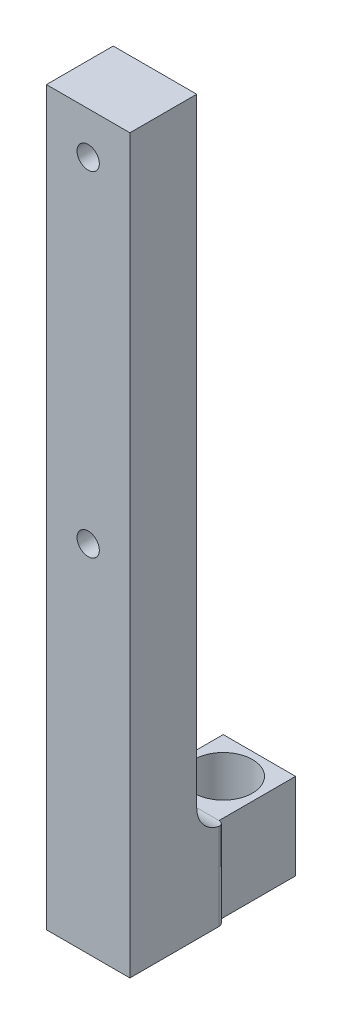
ISO-10303-21;
HEADER;
FILE_DESCRIPTION(('STEP AP214'),'2;1');
FILE_NAME('part.step','',(''),(''),'','','');
FILE_SCHEMA(('AUTOMOTIVE_DESIGN { 1 0 10303 214 1 1 1 1 }'));
ENDSEC;
DATA;
#1=APPLICATION_CONTEXT('core data for automotive mechanical design processes');
#2=APPLICATION_PROTOCOL_DEFINITION('international standard','automotive_design',2000,#1);
#3=PRODUCT_CONTEXT('',#1,'mechanical');
#4=PRODUCT('Part','Part','',(#3));
#5=PRODUCT_RELATED_PRODUCT_CATEGORY('part','',(#4));
#6=PRODUCT_DEFINITION_FORMATION('','',#4);
#7=PRODUCT_DEFINITION_CONTEXT('part definition',#1,'design');
#8=PRODUCT_DEFINITION('design','',#6,#7);
#9=PRODUCT_DEFINITION_SHAPE('','',#8);
#10=(LENGTH_UNIT() NAMED_UNIT(*) SI_UNIT(.MILLI.,.METRE.));
#11=(NAMED_UNIT(*) PLANE_ANGLE_UNIT() SI_UNIT($,.RADIAN.));
#12=(NAMED_UNIT(*) SI_UNIT($,.STERADIAN.) SOLID_ANGLE_UNIT());
#13=UNCERTAINTY_MEASURE_WITH_UNIT(LENGTH_MEASURE(1.E-05),#10,'distance_accuracy_value','');
#14=(GEOMETRIC_REPRESENTATION_CONTEXT(3) GLOBAL_UNCERTAINTY_ASSIGNED_CONTEXT((#13)) GLOBAL_UNIT_ASSIGNED_CONTEXT((#10,
#11,#12)) REPRESENTATION_CONTEXT('',''));
#15=CARTESIAN_POINT('',(0.,0.,0.));
#16=DIRECTION('',(0.,0.,1.));
#17=DIRECTION('',(1.,0.,0.));
#18=AXIS2_PLACEMENT_3D('',#15,#16,#17);
#19=CARTESIAN_POINT('',(3.25,65.76,6.13));
#20=DIRECTION('',(0.,0.,1.));
#21=DIRECTION('',(1.,0.,0.));
#22=AXIS2_PLACEMENT_3D('',#19,#20,#21);
#23=PLANE('',#22);
#24=DIRECTION('',(-1.,0.,0.));
#25=VECTOR('',#24,1.);
#26=CARTESIAN_POINT('',(3.25,65.76,6.13));
#27=LINE('',#26,#25);
#28=CARTESIAN_POINT('',(3.75,65.76,6.13));
#29=VERTEX_POINT('',#28);
#30=CARTESIAN_POINT('',(-3.75,65.76,6.13));
#31=VERTEX_POINT('',#30);
#32=EDGE_CURVE('E332',#29,#31,#27,.T.);
#33=ORIENTED_EDGE('',*,*,#32,.F.);
#34=DIRECTION('',(0.,1.,0.));
#35=VECTOR('',#34,1.);
#36=CARTESIAN_POINT('',(3.75,65.76,6.13));
#37=LINE('',#36,#35);
#38=CARTESIAN_POINT('',(3.75,10.25,6.13));
#39=VERTEX_POINT('',#38);
#40=EDGE_CURVE('E320',#39,#29,#37,.T.);
#41=ORIENTED_EDGE('',*,*,#40,.F.);
#42=DIRECTION('',(1.,0.,0.));
#43=VECTOR('',#42,1.);
#44=CARTESIAN_POINT('',(0.,10.25,6.13));
#45=LINE('',#44,#43);
#46=CARTESIAN_POINT('',(-3.75,10.25,6.13));
#47=VERTEX_POINT('',#46);
#48=EDGE_CURVE('E369',#39,#47,#45,.F.);
#49=ORIENTED_EDGE('',*,*,#48,.T.);
#50=DIRECTION('',(0.,1.,0.));
#51=VECTOR('',#50,1.);
#52=CARTESIAN_POINT('',(-3.75,65.76,6.13));
#53=LINE('',#52,#51);
#54=EDGE_CURVE('E312',#47,#31,#53,.T.);
#55=ORIENTED_EDGE('',*,*,#54,.T.);
#56=EDGE_LOOP('',(#33,#41,#49,#55));
#57=FACE_BOUND('',#56,.T.);
#58=DIRECTION('',(1.,0.,0.));
#59=VECTOR('',#58,1.);
#60=CARTESIAN_POINT('',(3.9427447207403E-13,63.923557158515,6.13));
#61=LINE('',#60,#59);
#62=CARTESIAN_POINT('',(-1.125,63.923557158515,6.13));
#63=VERTEX_POINT('',#62);
#64=CARTESIAN_POINT('',(1.12500000000001,63.923557158515,6.13));
#65=VERTEX_POINT('',#64);
#66=EDGE_CURVE('E272',#63,#65,#61,.T.);
#67=ORIENTED_EDGE('',*,*,#66,.F.);
#68=DIRECTION('',(0.5,0.866025403784439,0.));
#69=VECTOR('',#68,1.);
#70=CARTESIAN_POINT('',(-28.5234621997703,16.4680285792575,6.13));
#71=LINE('',#70,#69);
#72=CARTESIAN_POINT('',(-2.25000000000001,61.975,6.13));
#73=VERTEX_POINT('',#72);
#74=EDGE_CURVE('E64',#73,#63,#71,.T.);
#75=ORIENTED_EDGE('',*,*,#74,.F.);
#76=DIRECTION('',(-0.499999999999995,0.866025403784442,0.));
#77=VECTOR('',#76,1.);
#78=CARTESIAN_POINT('',(25.1484621997701,14.5194714207422,6.13));
#79=LINE('',#78,#77);
#80=CARTESIAN_POINT('',(-1.12500000000002,60.026442841485,6.13));
#81=VERTEX_POINT('',#80);
#82=EDGE_CURVE('E252',#81,#73,#79,.T.);
#83=ORIENTED_EDGE('',*,*,#82,.F.);
#84=DIRECTION('',(-1.,0.,0.));
#85=VECTOR('',#84,1.);
#86=CARTESIAN_POINT('',(5.55356157741354E-13,60.026442841485,6.13));
#87=LINE('',#86,#85);
#88=CARTESIAN_POINT('',(1.12499999999998,60.026442841485,6.13));
#89=VERTEX_POINT('',#88);
#90=EDGE_CURVE('E281',#89,#81,#87,.T.);
#91=ORIENTED_EDGE('',*,*,#90,.F.);
#92=DIRECTION('',(-0.500000000000007,-0.866025403784435,0.));
#93=VECTOR('',#92,1.);
#94=CARTESIAN_POINT('',(-25.1484621997706,14.5194714207429,6.13));
#95=LINE('',#94,#93);
#96=CARTESIAN_POINT('',(2.25000000000001,61.975,6.13));
#97=VERTEX_POINT('',#96);
#98=EDGE_CURVE('E278',#97,#89,#95,.T.);
#99=ORIENTED_EDGE('',*,*,#98,.F.);
#100=DIRECTION('',(0.499999999999995,-0.866025403784441,0.));
#101=VECTOR('',#100,1.);
#102=CARTESIAN_POINT('',(28.5234621997701,16.4680285792572,6.13));
#103=LINE('',#102,#101);
#104=EDGE_CURVE('E275',#65,#97,#103,.T.);
#105=ORIENTED_EDGE('',*,*,#104,.F.);
#106=EDGE_LOOP('',(#67,#75,#83,#91,#99,#105));
#107=FACE_BOUND('',#106,.T.);
#108=DIRECTION('',(0.5,-0.866025403784439,0.));
#109=VECTOR('',#108,1.);
#110=CARTESIAN_POINT('',(-28.5234621997703,77.4119714207425,6.13));
#111=LINE('',#110,#109);
#112=CARTESIAN_POINT('',(-2.25,31.905,6.13));
#113=VERTEX_POINT('',#112);
#114=CARTESIAN_POINT('',(-1.125,29.956442841485,6.13));
#115=VERTEX_POINT('',#114);
#116=EDGE_CURVE('E56',#113,#115,#111,.T.);
#117=ORIENTED_EDGE('',*,*,#116,.T.);
#118=DIRECTION('',(1.,0.,0.));
#119=VECTOR('',#118,1.);
#120=CARTESIAN_POINT('',(3.9427447207403E-13,29.956442841485,6.13));
#121=LINE('',#120,#119);
#122=CARTESIAN_POINT('',(1.12500000000001,29.956442841485,6.13));
#123=VERTEX_POINT('',#122);
#124=EDGE_CURVE('E213',#115,#123,#121,.T.);
#125=ORIENTED_EDGE('',*,*,#124,.T.);
#126=DIRECTION('',(0.499999999999995,0.866025403784441,0.));
#127=VECTOR('',#126,1.);
#128=CARTESIAN_POINT('',(28.5234621997701,77.4119714207428,6.13));
#129=LINE('',#128,#127);
#130=CARTESIAN_POINT('',(2.25000000000001,31.905,6.13));
#131=VERTEX_POINT('',#130);
#132=EDGE_CURVE('E231',#123,#131,#129,.T.);
#133=ORIENTED_EDGE('',*,*,#132,.T.);
#134=DIRECTION('',(-0.500000000000007,0.866025403784435,0.));
#135=VECTOR('',#134,1.);
#136=CARTESIAN_POINT('',(-25.1484621997706,79.3605285792571,6.13));
#137=LINE('',#136,#135);
#138=CARTESIAN_POINT('',(1.12499999999998,33.853557158515,6.13));
#139=VERTEX_POINT('',#138);
#140=EDGE_CURVE('E228',#131,#139,#137,.T.);
#141=ORIENTED_EDGE('',*,*,#140,.T.);
#142=DIRECTION('',(-1.,0.,0.));
#143=VECTOR('',#142,1.);
#144=CARTESIAN_POINT('',(5.55356157741354E-13,33.853557158515,6.13));
#145=LINE('',#144,#143);
#146=CARTESIAN_POINT('',(-1.12500000000002,33.853557158515,6.13));
#147=VERTEX_POINT('',#146);
#148=EDGE_CURVE('E225',#139,#147,#145,.T.);
#149=ORIENTED_EDGE('',*,*,#148,.T.);
#150=DIRECTION('',(-0.499999999999995,-0.866025403784442,0.));
#151=VECTOR('',#150,1.);
#152=CARTESIAN_POINT('',(25.1484621997701,79.3605285792578,6.13));
#153=LINE('',#152,#151);
#154=EDGE_CURVE('E223',#147,#113,#153,.T.);
#155=ORIENTED_EDGE('',*,*,#154,.T.);
#156=EDGE_LOOP('',(#117,#125,#133,#141,#149,#155));
#157=FACE_BOUND('',#156,.T.);
#158=ADVANCED_FACE('F35',(#57,#107,#157),#23,.F.);
#159=CARTESIAN_POINT('',(0.,31.905,12.13));
#160=DIRECTION('',(0.,0.,-1.));
#161=DIRECTION('',(-1.,0.,0.));
#162=AXIS2_PLACEMENT_3D('',#159,#160,#161);
#163=CYLINDRICAL_SURFACE('',#162,1.);
#164=CARTESIAN_POINT('',(0.,31.905,12.13));
#165=DIRECTION('',(0.,0.,1.));
#166=DIRECTION('',(-1.,0.,0.));
#167=AXIS2_PLACEMENT_3D('',#164,#165,#166);
#168=CIRCLE('',#167,1.);
#169=CARTESIAN_POINT('',(-1.,31.905,12.13));
#170=VERTEX_POINT('',#169);
#171=EDGE_CURVE('E238',#170,#170,#168,.T.);
#172=ORIENTED_EDGE('',*,*,#171,.T.);
#173=EDGE_LOOP('',(#172));
#174=FACE_BOUND('',#173,.T.);
#175=CARTESIAN_POINT('',(0.,31.905,8.13));
#176=DIRECTION('',(0.,0.,1.));
#177=DIRECTION('',(-1.,0.,0.));
#178=AXIS2_PLACEMENT_3D('',#175,#176,#177);
#179=CIRCLE('',#178,1.);
#180=CARTESIAN_POINT('',(-1.,31.905,8.13));
#181=VERTEX_POINT('',#180);
#182=EDGE_CURVE('E210',#181,#181,#179,.T.);
#183=ORIENTED_EDGE('',*,*,#182,.F.);
#184=EDGE_LOOP('',(#183));
#185=FACE_BOUND('',#184,.T.);
#186=ADVANCED_FACE('F422',(#174,#185),#163,.F.);
#187=CARTESIAN_POINT('',(0.,61.975,12.13));
#188=DIRECTION('',(0.,0.,-1.));
#189=DIRECTION('',(-1.,0.,0.));
#190=AXIS2_PLACEMENT_3D('',#187,#188,#189);
#191=CYLINDRICAL_SURFACE('',#190,1.);
#192=CARTESIAN_POINT('',(0.,61.975,12.13));
#193=DIRECTION('',(0.,0.,-1.));
#194=DIRECTION('',(-1.,0.,0.));
#195=AXIS2_PLACEMENT_3D('',#192,#193,#194);
#196=CIRCLE('',#195,1.);
#197=CARTESIAN_POINT('',(-1.,61.975,12.13));
#198=VERTEX_POINT('',#197);
#199=EDGE_CURVE('E288',#198,#198,#196,.T.);
#200=ORIENTED_EDGE('',*,*,#199,.F.);
#201=EDGE_LOOP('',(#200));
#202=FACE_BOUND('',#201,.T.);
#203=CARTESIAN_POINT('',(0.,61.975,8.13));
#204=DIRECTION('',(0.,0.,-1.));
#205=DIRECTION('',(-1.,0.,0.));
#206=AXIS2_PLACEMENT_3D('',#203,#204,#205);
#207=CIRCLE('',#206,1.);
#208=CARTESIAN_POINT('',(-1.,61.975,8.13));
#209=VERTEX_POINT('',#208);
#210=EDGE_CURVE('E248',#209,#209,#207,.T.);
#211=ORIENTED_EDGE('',*,*,#210,.T.);
#212=EDGE_LOOP('',(#211));
#213=FACE_BOUND('',#212,.T.);
#214=ADVANCED_FACE('F436',(#202,#213),#191,.F.);
#215=CARTESIAN_POINT('',(-3.25,7.75,4.13));
#216=DIRECTION('',(0.,1.,0.));
#217=DIRECTION('',(0.,0.,1.));
#218=AXIS2_PLACEMENT_3D('',#215,#216,#217);
#219=CYLINDRICAL_SURFACE('',#218,0.5);
#220=DIRECTION('',(0.,1.,0.));
#221=VECTOR('',#220,1.);
#222=CARTESIAN_POINT('',(-3.25,7.75,3.63));
#223=LINE('',#222,#221);
#224=CARTESIAN_POINT('',(-3.25,0.,3.63));
#225=VERTEX_POINT('',#224);
#226=CARTESIAN_POINT('',(-3.25,7.75,3.63));
#227=VERTEX_POINT('',#226);
#228=EDGE_CURVE('E300',#225,#227,#223,.T.);
#229=ORIENTED_EDGE('',*,*,#228,.F.);
#230=CARTESIAN_POINT('',(-3.25,0.,4.13));
#231=DIRECTION('',(0.,-1.,0.));
#232=DIRECTION('',(0.,0.,-1.));
#233=AXIS2_PLACEMENT_3D('',#230,#231,#232);
#234=CIRCLE('',#233,0.5);
#235=CARTESIAN_POINT('',(-3.75,0.,4.13));
#236=VERTEX_POINT('',#235);
#237=EDGE_CURVE('E49',#236,#225,#234,.T.);
#238=ORIENTED_EDGE('',*,*,#237,.F.);
#239=DIRECTION('',(0.,1.,0.));
#240=VECTOR('',#239,1.);
#241=CARTESIAN_POINT('',(-3.75,10.25,4.13));
#242=LINE('',#241,#240);
#243=CARTESIAN_POINT('',(-3.75,7.80051025721682,4.13));
#244=VERTEX_POINT('',#243);
#245=EDGE_CURVE('E719',#244,#236,#242,.F.);
#246=ORIENTED_EDGE('',*,*,#245,.F.);
#247=CARTESIAN_POINT('',(-3.25,7.75,3.63));
#248=CARTESIAN_POINT('',(-3.27811796867564,7.75001350479178,3.62997612322947));
#249=CARTESIAN_POINT('',(-3.30622892015877,7.75000022666916,3.63237043659712));
#250=CARTESIAN_POINT('',(-3.3616366477215,7.75001991181192,3.64181966246556));
#251=CARTESIAN_POINT('',(-3.38893399105107,7.75005284205222,3.64887124451382));
#252=CARTESIAN_POINT('',(-3.44197007810284,7.75026453856159,3.66746435596307));
#253=CARTESIAN_POINT('',(-3.46770803201026,7.75044337807973,3.6790081390068));
#254=CARTESIAN_POINT('',(-3.51687477779326,7.7511257383998,3.70624646910356));
#255=CARTESIAN_POINT('',(-3.54030396204742,7.751629203921,3.72194030917288));
#256=CARTESIAN_POINT('',(-3.5841500275298,7.7531664979102,3.75699809480811));
#257=CARTESIAN_POINT('',(-3.60457189855436,7.75419943480825,3.77635583632551));
#258=CARTESIAN_POINT('',(-3.64186632251646,7.75700517407253,3.81818944537067));
#259=CARTESIAN_POINT('',(-3.65873877310279,7.75877799776977,3.84066540278443));
#260=CARTESIAN_POINT('',(-3.68835561984083,7.76322502599789,3.88789210588923));
#261=CARTESIAN_POINT('',(-3.70112731570515,7.76589301699762,3.91262633769203));
#262=CARTESIAN_POINT('',(-3.72236463562713,7.77224513616485,3.96375586246409));
#263=CARTESIAN_POINT('',(-3.73083159989518,7.77592894752111,3.99015063557054));
#264=CARTESIAN_POINT('',(-3.74137567934133,7.78304593860156,4.03557736930904));
#265=CARTESIAN_POINT('',(-3.74461523645419,7.78621093928278,4.05439113488874));
#266=CARTESIAN_POINT('',(-3.74892750315418,7.79301228301311,4.09215039938355));
#267=CARTESIAN_POINT('',(-3.75000362547753,7.79664787406413,4.11109564344111));
#268=CARTESIAN_POINT('',(-3.75,7.80051025721682,4.13));
#269=B_SPLINE_CURVE_WITH_KNOTS('',3,(#247,#248,#249,#250,#251,#252,#253,#254,#255,#256,#257,
#258,#259,#260,#261,#262,#263,#264,#265,#266,#267,#268),.UNSPECIFIED.,.F.,.F.,(4,2,2,2,2,2,2,2,
2,2,4),(0.,0.084242137406245,0.168424097674834,0.252648344820536,0.336858253162449,
0.420926825098985,0.504997820907863,0.588496937177002,0.671970041367538,0.729903085059683,
0.787744669642072),.UNSPECIFIED.);
#270=EDGE_CURVE('E11',#227,#244,#269,.T.);
#271=ORIENTED_EDGE('',*,*,#270,.F.);
#272=EDGE_LOOP('',(#229,#238,#246,#271));
#273=FACE_BOUND('',#272,.T.);
#274=ADVANCED_FACE('F37',(#273),#219,.T.);
#275=CARTESIAN_POINT('',(3.25,7.75,4.13));
#276=DIRECTION('',(0.,1.,0.));
#277=DIRECTION('',(0.,0.,1.));
#278=AXIS2_PLACEMENT_3D('',#275,#276,#277);
#279=CYLINDRICAL_SURFACE('',#278,0.5);
#280=DIRECTION('',(0.,1.,0.));
#281=VECTOR('',#280,1.);
#282=CARTESIAN_POINT('',(3.25,7.75,3.63));
#283=LINE('',#282,#281);
#284=CARTESIAN_POINT('',(3.25,0.,3.63));
#285=VERTEX_POINT('',#284);
#286=CARTESIAN_POINT('',(3.25,7.75,3.63));
#287=VERTEX_POINT('',#286);
#288=EDGE_CURVE('E315',#285,#287,#283,.T.);
#289=ORIENTED_EDGE('',*,*,#288,.T.);
#290=CARTESIAN_POINT('',(3.75,7.80051025721682,4.13));
#291=CARTESIAN_POINT('',(3.75002723463794,7.79487802387271,4.10249827936634));
#292=CARTESIAN_POINT('',(3.74773190742809,7.78974311098771,4.07489045914946));
#293=CARTESIAN_POINT('',(3.73858967513809,7.78050078664527,4.02027706819769));
#294=CARTESIAN_POINT('',(3.73174492130736,7.77639289081367,3.9932712190488));
#295=CARTESIAN_POINT('',(3.71358720155995,7.7692281220896,3.94061962414265));
#296=CARTESIAN_POINT('',(3.70226930392815,7.76617241623572,3.91497541513479));
#297=CARTESIAN_POINT('',(3.6754638280945,7.76103007160169,3.86587476542237));
#298=CARTESIAN_POINT('',(3.65997784401457,7.75894306316425,3.84241749291281));
#299=CARTESIAN_POINT('',(3.62544375632443,7.75559713184014,3.79862128976411));
#300=CARTESIAN_POINT('',(3.60643413557245,7.75432987072405,3.77825262691217));
#301=CARTESIAN_POINT('',(3.56527711421119,7.75239243489575,3.74093430832135));
#302=CARTESIAN_POINT('',(3.54312885853229,7.75172242325819,3.72398558734963));
#303=CARTESIAN_POINT('',(3.49621783360492,7.75077194959066,3.69393059034352));
#304=CARTESIAN_POINT('',(3.4714438044777,7.75049324477952,3.68084185438374));
#305=CARTESIAN_POINT('',(3.42006335573135,7.75014399668806,3.65898308387183));
#306=CARTESIAN_POINT('',(3.39345783736841,7.75007335176254,3.65021094224361));
#307=CARTESIAN_POINT('',(3.34727684854197,7.75001258026441,3.63916269544265));
#308=CARTESIAN_POINT('',(3.32796984909474,7.75000472951704,3.63572966520292));
#309=CARTESIAN_POINT('',(3.28911111184987,7.74999999968408,3.63114796203564));
#310=CARTESIAN_POINT('',(3.26955970798001,7.75000310697704,3.62999645582884));
#311=CARTESIAN_POINT('',(3.25,7.75,3.63));
#312=B_SPLINE_CURVE_WITH_KNOTS('',3,(#290,#291,#292,#293,#294,#295,#296,#297,#298,#299,#300,
#301,#302,#303,#304,#305,#306,#307,#308,#309,#310,#311),.UNSPECIFIED.,.F.,.F.,(4,2,2,2,2,2,2,2,
2,2,4),(0.,0.0841256377617448,0.168211524008654,0.252390376112381,0.336537078897921,
0.419813816420467,0.503113285097263,0.586785638288214,0.670417107549462,0.729119305789693,
0.787748559707485),.UNSPECIFIED.);
#313=CARTESIAN_POINT('',(3.75,7.80051025721682,4.13));
#314=VERTEX_POINT('',#313);
#315=EDGE_CURVE('E375',#314,#287,#312,.T.);
#316=ORIENTED_EDGE('',*,*,#315,.F.);
#317=DIRECTION('',(0.,-1.,0.));
#318=VECTOR('',#317,1.);
#319=CARTESIAN_POINT('',(3.75,7.75,4.13));
#320=LINE('',#319,#318);
#321=CARTESIAN_POINT('',(3.75,0.,4.13));
#322=VERTEX_POINT('',#321);
#323=EDGE_CURVE('E372',#322,#314,#320,.F.);
#324=ORIENTED_EDGE('',*,*,#323,.F.);
#325=CARTESIAN_POINT('',(3.25,0.,4.13));
#326=DIRECTION('',(0.,-1.,0.));
#327=DIRECTION('',(0.,0.,-1.));
#328=AXIS2_PLACEMENT_3D('',#325,#326,#327);
#329=CIRCLE('',#328,0.5);
#330=EDGE_CURVE('E381',#285,#322,#329,.T.);
#331=ORIENTED_EDGE('',*,*,#330,.F.);
#332=EDGE_LOOP('',(#289,#316,#324,#331));
#333=FACE_BOUND('',#332,.T.);
#334=ADVANCED_FACE('F383',(#333),#279,.T.);
#335=CARTESIAN_POINT('',(3.25,7.75,3.25));
#336=DIRECTION('',(-1.,0.,0.));
#337=DIRECTION('',(0.,0.,1.));
#338=AXIS2_PLACEMENT_3D('',#335,#336,#337);
#339=PLANE('',#338);
#340=ORIENTED_EDGE('',*,*,#288,.F.);
#341=DIRECTION('',(0.,0.,-1.));
#342=VECTOR('',#341,1.);
#343=CARTESIAN_POINT('',(3.25,0.,3.25));
#344=LINE('',#343,#342);
#345=CARTESIAN_POINT('',(3.25,0.,-3.25));
#346=VERTEX_POINT('',#345);
#347=EDGE_CURVE('E358',#285,#346,#344,.T.);
#348=ORIENTED_EDGE('',*,*,#347,.T.);
#349=DIRECTION('',(0.,-1.,0.));
#350=VECTOR('',#349,1.);
#351=CARTESIAN_POINT('',(3.25,7.75,-3.25));
#352=LINE('',#351,#350);
#353=CARTESIAN_POINT('',(3.25,7.75,-3.25));
#354=VERTEX_POINT('',#353);
#355=EDGE_CURVE('E363',#354,#346,#352,.T.);
#356=ORIENTED_EDGE('',*,*,#355,.F.);
#357=DIRECTION('',(0.,0.,-1.));
#358=VECTOR('',#357,1.);
#359=CARTESIAN_POINT('',(3.25,7.75,3.25));
#360=LINE('',#359,#358);
#361=EDGE_CURVE('E350',#287,#354,#360,.T.);
#362=ORIENTED_EDGE('',*,*,#361,.F.);
#363=EDGE_LOOP('',(#340,#348,#356,#362));
#364=FACE_BOUND('',#363,.T.);
#365=ADVANCED_FACE('F390',(#364),#339,.F.);
#366=CARTESIAN_POINT('',(0.,10.25,3.63));
#367=DIRECTION('',(-1.,0.,0.));
#368=DIRECTION('',(0.,0.,1.));
#369=AXIS2_PLACEMENT_3D('',#366,#367,#368);
#370=CYLINDRICAL_SURFACE('',#369,2.5);
#371=DIRECTION('',(1.,0.,0.));
#372=VECTOR('',#371,1.);
#373=CARTESIAN_POINT('',(0.,7.75,3.63));
#374=LINE('',#373,#372);
#375=EDGE_CURVE('E366',#227,#287,#374,.T.);
#376=ORIENTED_EDGE('',*,*,#375,.F.);
#377=ORIENTED_EDGE('',*,*,#270,.T.);
#378=CARTESIAN_POINT('',(-3.75,10.25,3.62999999999999));
#379=DIRECTION('',(-1.,0.,0.));
#380=DIRECTION('',(0.,0.,-1.));
#381=AXIS2_PLACEMENT_3D('',#378,#379,#380);
#382=CIRCLE('',#381,2.50000000000001);
#383=EDGE_CURVE('E301',#244,#47,#382,.T.);
#384=ORIENTED_EDGE('',*,*,#383,.T.);
#385=ORIENTED_EDGE('',*,*,#48,.F.);
#386=CARTESIAN_POINT('',(3.75,10.25,3.62999999999999));
#387=DIRECTION('',(-1.,0.,0.));
#388=DIRECTION('',(0.,0.,-1.));
#389=AXIS2_PLACEMENT_3D('',#386,#387,#388);
#390=CIRCLE('',#389,2.50000000000001);
#391=EDGE_CURVE('E318',#314,#39,#390,.T.);
#392=ORIENTED_EDGE('',*,*,#391,.F.);
#393=ORIENTED_EDGE('',*,*,#315,.T.);
#394=EDGE_LOOP('',(#376,#377,#384,#385,#392,#393));
#395=FACE_BOUND('',#394,.T.);
#396=ADVANCED_FACE('F385',(#395),#370,.F.);
#397=CARTESIAN_POINT('',(0.,7.75,0.));
#398=DIRECTION('',(0.,-1.,0.));
#399=DIRECTION('',(0.,0.,-1.));
#400=AXIS2_PLACEMENT_3D('',#397,#398,#399);
#401=PLANE('',#400);
#402=CARTESIAN_POINT('',(0.,7.75,0.));
#403=DIRECTION('',(0.,1.,0.));
#404=DIRECTION('',(0.,0.,1.));
#405=AXIS2_PLACEMENT_3D('',#402,#403,#404);
#406=CIRCLE('',#405,2.625);
#407=CARTESIAN_POINT('',(0.,7.75,2.625));
#408=VERTEX_POINT('',#407);
#409=EDGE_CURVE('E341',#408,#408,#406,.T.);
#410=ORIENTED_EDGE('',*,*,#409,.F.);
#411=EDGE_LOOP('',(#410));
#412=FACE_BOUND('',#411,.T.);
#413=DIRECTION('',(0.,0.,1.));
#414=VECTOR('',#413,1.);
#415=CARTESIAN_POINT('',(-3.25,7.75,3.25));
#416=LINE('',#415,#414);
#417=CARTESIAN_POINT('',(-3.25,7.75,-3.25));
#418=VERTEX_POINT('',#417);
#419=EDGE_CURVE('E347',#418,#227,#416,.T.);
#420=ORIENTED_EDGE('',*,*,#419,.T.);
#421=ORIENTED_EDGE('',*,*,#375,.T.);
#422=ORIENTED_EDGE('',*,*,#361,.T.);
#423=DIRECTION('',(-1.,0.,0.));
#424=VECTOR('',#423,1.);
#425=CARTESIAN_POINT('',(-3.25,7.75,-3.25));
#426=LINE('',#425,#424);
#427=EDGE_CURVE('E353',#354,#418,#426,.T.);
#428=ORIENTED_EDGE('',*,*,#427,.T.);
#429=EDGE_LOOP('',(#420,#421,#422,#428));
#430=FACE_BOUND('',#429,.T.);
#431=ADVANCED_FACE('F389',(#412,#430),#401,.F.);
#432=CARTESIAN_POINT('',(0.,0.,0.));
#433=DIRECTION('',(0.,-1.,0.));
#434=DIRECTION('',(0.,0.,-1.));
#435=AXIS2_PLACEMENT_3D('',#432,#433,#434);
#436=PLANE('',#435);
#437=DIRECTION('',(0.,0.,-1.));
#438=VECTOR('',#437,1.);
#439=CARTESIAN_POINT('',(-3.75,0.,3.63));
#440=LINE('',#439,#438);
#441=CARTESIAN_POINT('',(-3.75,0.,12.13));
#442=VERTEX_POINT('',#441);
#443=EDGE_CURVE('E303',#442,#236,#440,.T.);
#444=ORIENTED_EDGE('',*,*,#443,.T.);
#445=ORIENTED_EDGE('',*,*,#237,.T.);
#446=DIRECTION('',(0.,0.,1.));
#447=VECTOR('',#446,1.);
#448=CARTESIAN_POINT('',(-3.25,0.,3.25));
#449=LINE('',#448,#447);
#450=CARTESIAN_POINT('',(-3.25,0.,-3.25));
#451=VERTEX_POINT('',#450);
#452=EDGE_CURVE('E344',#451,#225,#449,.T.);
#453=ORIENTED_EDGE('',*,*,#452,.F.);
#454=DIRECTION('',(-1.,0.,0.));
#455=VECTOR('',#454,1.);
#456=CARTESIAN_POINT('',(-3.25,0.,-3.25));
#457=LINE('',#456,#455);
#458=EDGE_CURVE('E351',#346,#451,#457,.T.);
#459=ORIENTED_EDGE('',*,*,#458,.F.);
#460=ORIENTED_EDGE('',*,*,#347,.F.);
#461=ORIENTED_EDGE('',*,*,#330,.T.);
#462=DIRECTION('',(0.,0.,-1.));
#463=VECTOR('',#462,1.);
#464=CARTESIAN_POINT('',(3.75,0.,3.63));
#465=LINE('',#464,#463);
#466=CARTESIAN_POINT('',(3.75,0.,12.13));
#467=VERTEX_POINT('',#466);
#468=EDGE_CURVE('E329',#467,#322,#465,.T.);
#469=ORIENTED_EDGE('',*,*,#468,.F.);
#470=DIRECTION('',(1.,0.,0.));
#471=VECTOR('',#470,1.);
#472=CARTESIAN_POINT('',(3.25,0.,12.13));
#473=LINE('',#472,#471);
#474=EDGE_CURVE('E338',#442,#467,#473,.T.);
#475=ORIENTED_EDGE('',*,*,#474,.F.);
#476=EDGE_LOOP('',(#444,#445,#453,#459,#460,#461,#469,#475));
#477=FACE_BOUND('',#476,.T.);
#478=CARTESIAN_POINT('',(0.,0.,0.));
#479=DIRECTION('',(0.,1.,0.));
#480=DIRECTION('',(0.,0.,1.));
#481=AXIS2_PLACEMENT_3D('',#478,#479,#480);
#482=CIRCLE('',#481,2.625);
#483=CARTESIAN_POINT('',(0.,0.,2.625));
#484=VERTEX_POINT('',#483);
#485=EDGE_CURVE('E340',#484,#484,#482,.T.);
#486=ORIENTED_EDGE('',*,*,#485,.T.);
#487=EDGE_LOOP('',(#486));
#488=FACE_BOUND('',#487,.T.);
#489=ADVANCED_FACE('F397',(#477,#488),#436,.T.);
#490=CARTESIAN_POINT('',(-3.25,7.75,3.25));
#491=DIRECTION('',(1.,0.,0.));
#492=DIRECTION('',(0.,0.,-1.));
#493=AXIS2_PLACEMENT_3D('',#490,#491,#492);
#494=PLANE('',#493);
#495=ORIENTED_EDGE('',*,*,#452,.T.);
#496=ORIENTED_EDGE('',*,*,#228,.T.);
#497=ORIENTED_EDGE('',*,*,#419,.F.);
#498=DIRECTION('',(0.,-1.,0.));
#499=VECTOR('',#498,1.);
#500=CARTESIAN_POINT('',(-3.25,7.75,-3.25));
#501=LINE('',#500,#499);
#502=EDGE_CURVE('E355',#418,#451,#501,.T.);
#503=ORIENTED_EDGE('',*,*,#502,.T.);
#504=EDGE_LOOP('',(#495,#496,#497,#503));
#505=FACE_BOUND('',#504,.T.);
#506=ADVANCED_FACE('F392',(#505),#494,.F.);
#507=CARTESIAN_POINT('',(-3.25,7.75,-3.25));
#508=DIRECTION('',(0.,0.,1.));
#509=DIRECTION('',(1.,0.,0.));
#510=AXIS2_PLACEMENT_3D('',#507,#508,#509);
#511=PLANE('',#510);
#512=ORIENTED_EDGE('',*,*,#458,.T.);
#513=ORIENTED_EDGE('',*,*,#502,.F.);
#514=ORIENTED_EDGE('',*,*,#427,.F.);
#515=ORIENTED_EDGE('',*,*,#355,.T.);
#516=EDGE_LOOP('',(#512,#513,#514,#515));
#517=FACE_BOUND('',#516,.T.);
#518=ADVANCED_FACE('F396',(#517),#511,.F.);
#519=CARTESIAN_POINT('',(0.,7.75,0.));
#520=DIRECTION('',(0.,-1.,0.));
#521=DIRECTION('',(0.,0.,-1.));
#522=AXIS2_PLACEMENT_3D('',#519,#520,#521);
#523=CYLINDRICAL_SURFACE('',#522,2.625);
#524=ORIENTED_EDGE('',*,*,#409,.T.);
#525=EDGE_LOOP('',(#524));
#526=FACE_BOUND('',#525,.T.);
#527=ORIENTED_EDGE('',*,*,#485,.F.);
#528=EDGE_LOOP('',(#527));
#529=FACE_BOUND('',#528,.T.);
#530=ADVANCED_FACE('F404',(#526,#529),#523,.F.);
#531=CARTESIAN_POINT('',(0.,0.,12.13));
#532=DIRECTION('',(0.,0.,1.));
#533=DIRECTION('',(1.,0.,0.));
#534=AXIS2_PLACEMENT_3D('',#531,#532,#533);
#535=PLANE('',#534);
#536=ORIENTED_EDGE('',*,*,#171,.F.);
#537=EDGE_LOOP('',(#536));
#538=FACE_BOUND('',#537,.T.);
#539=ORIENTED_EDGE('',*,*,#199,.T.);
#540=EDGE_LOOP('',(#539));
#541=FACE_BOUND('',#540,.T.);
#542=ORIENTED_EDGE('',*,*,#474,.T.);
#543=DIRECTION('',(0.,-1.,0.));
#544=VECTOR('',#543,1.);
#545=CARTESIAN_POINT('',(3.75,0.,12.13));
#546=LINE('',#545,#544);
#547=CARTESIAN_POINT('',(3.75,65.76,12.13));
#548=VERTEX_POINT('',#547);
#549=EDGE_CURVE('E326',#548,#467,#546,.T.);
#550=ORIENTED_EDGE('',*,*,#549,.F.);
#551=DIRECTION('',(1.,0.,0.));
#552=VECTOR('',#551,1.);
#553=CARTESIAN_POINT('',(3.25,65.76,12.13));
#554=LINE('',#553,#552);
#555=CARTESIAN_POINT('',(-3.75,65.76,12.13));
#556=VERTEX_POINT('',#555);
#557=EDGE_CURVE('E336',#556,#548,#554,.T.);
#558=ORIENTED_EDGE('',*,*,#557,.F.);
#559=DIRECTION('',(0.,-1.,0.));
#560=VECTOR('',#559,1.);
#561=CARTESIAN_POINT('',(-3.75,0.,12.13));
#562=LINE('',#561,#560);
#563=EDGE_CURVE('E306',#556,#442,#562,.T.);
#564=ORIENTED_EDGE('',*,*,#563,.T.);
#565=EDGE_LOOP('',(#542,#550,#558,#564));
#566=FACE_BOUND('',#565,.T.);
#567=ADVANCED_FACE('F414',(#538,#541,#566),#535,.T.);
#568=CARTESIAN_POINT('',(0.,65.76,0.));
#569=DIRECTION('',(0.,1.,0.));
#570=DIRECTION('',(0.,0.,1.));
#571=AXIS2_PLACEMENT_3D('',#568,#569,#570);
#572=PLANE('',#571);
#573=ORIENTED_EDGE('',*,*,#557,.T.);
#574=DIRECTION('',(0.,0.,1.));
#575=VECTOR('',#574,1.);
#576=CARTESIAN_POINT('',(3.75,65.76,12.13));
#577=LINE('',#576,#575);
#578=EDGE_CURVE('E323',#29,#548,#577,.T.);
#579=ORIENTED_EDGE('',*,*,#578,.F.);
#580=ORIENTED_EDGE('',*,*,#32,.T.);
#581=DIRECTION('',(0.,0.,1.));
#582=VECTOR('',#581,1.);
#583=CARTESIAN_POINT('',(-3.75,65.76,12.13));
#584=LINE('',#583,#582);
#585=EDGE_CURVE('E309',#31,#556,#584,.T.);
#586=ORIENTED_EDGE('',*,*,#585,.T.);
#587=EDGE_LOOP('',(#573,#579,#580,#586));
#588=FACE_BOUND('',#587,.T.);
#589=ADVANCED_FACE('F418',(#588),#572,.T.);
#590=CARTESIAN_POINT('',(3.75,10.25,3.62999999999999));
#591=DIRECTION('',(1.,0.,0.));
#592=DIRECTION('',(0.,0.,-1.));
#593=AXIS2_PLACEMENT_3D('',#590,#591,#592);
#594=PLANE('',#593);
#595=ORIENTED_EDGE('',*,*,#468,.T.);
#596=ORIENTED_EDGE('',*,*,#323,.T.);
#597=ORIENTED_EDGE('',*,*,#391,.T.);
#598=ORIENTED_EDGE('',*,*,#40,.T.);
#599=ORIENTED_EDGE('',*,*,#578,.T.);
#600=ORIENTED_EDGE('',*,*,#549,.T.);
#601=EDGE_LOOP('',(#595,#596,#597,#598,#599,#600));
#602=FACE_BOUND('',#601,.T.);
#603=ADVANCED_FACE('F426',(#602),#594,.T.);
#604=CARTESIAN_POINT('',(-3.75,10.25,3.62999999999999));
#605=DIRECTION('',(-1.,0.,0.));
#606=DIRECTION('',(0.,0.,-1.));
#607=AXIS2_PLACEMENT_3D('',#604,#605,#606);
#608=PLANE('',#607);
#609=ORIENTED_EDGE('',*,*,#383,.F.);
#610=ORIENTED_EDGE('',*,*,#245,.T.);
#611=ORIENTED_EDGE('',*,*,#443,.F.);
#612=ORIENTED_EDGE('',*,*,#563,.F.);
#613=ORIENTED_EDGE('',*,*,#585,.F.);
#614=ORIENTED_EDGE('',*,*,#54,.F.);
#615=EDGE_LOOP('',(#609,#610,#611,#612,#613,#614));
#616=FACE_BOUND('',#615,.T.);
#617=ADVANCED_FACE('F430',(#616),#608,.T.);
#618=CARTESIAN_POINT('',(-28.5234621997703,16.4680285792575,8.13));
#619=DIRECTION('',(-0.866025403784439,0.5,0.));
#620=DIRECTION('',(-0.5,-0.866025403784439,0.));
#621=AXIS2_PLACEMENT_3D('',#618,#619,#620);
#622=PLANE('',#621);
#623=ORIENTED_EDGE('',*,*,#74,.T.);
#624=DIRECTION('',(0.,0.,-1.));
#625=VECTOR('',#624,1.);
#626=CARTESIAN_POINT('',(-1.125,63.923557158515,8.13));
#627=LINE('',#626,#625);
#628=CARTESIAN_POINT('',(-1.125,63.923557158515,8.13));
#629=VERTEX_POINT('',#628);
#630=EDGE_CURVE('E270',#629,#63,#627,.T.);
#631=ORIENTED_EDGE('',*,*,#630,.F.);
#632=DIRECTION('',(0.5,0.866025403784439,0.));
#633=VECTOR('',#632,1.);
#634=CARTESIAN_POINT('',(-28.5234621997703,16.4680285792575,8.13));
#635=LINE('',#634,#633);
#636=CARTESIAN_POINT('',(-2.25000000000001,61.975,8.13));
#637=VERTEX_POINT('',#636);
#638=EDGE_CURVE('E251',#637,#629,#635,.T.);
#639=ORIENTED_EDGE('',*,*,#638,.F.);
#640=DIRECTION('',(0.,0.,-1.));
#641=VECTOR('',#640,1.);
#642=CARTESIAN_POINT('',(-2.25000000000001,61.975,8.13));
#643=LINE('',#642,#641);
#644=EDGE_CURVE('E286',#637,#73,#643,.T.);
#645=ORIENTED_EDGE('',*,*,#644,.T.);
#646=EDGE_LOOP('',(#623,#631,#639,#645));
#647=FACE_BOUND('',#646,.T.);
#648=ADVANCED_FACE('F434',(#647),#622,.F.);
#649=CARTESIAN_POINT('',(25.1484621997701,14.5194714207422,8.13));
#650=DIRECTION('',(-0.866025403784442,-0.499999999999995,0.));
#651=DIRECTION('',(0.499999999999995,-0.866025403784442,0.));
#652=AXIS2_PLACEMENT_3D('',#649,#650,#651);
#653=PLANE('',#652);
#654=ORIENTED_EDGE('',*,*,#82,.T.);
#655=ORIENTED_EDGE('',*,*,#644,.F.);
#656=DIRECTION('',(-0.499999999999995,0.866025403784442,0.));
#657=VECTOR('',#656,1.);
#658=CARTESIAN_POINT('',(25.1484621997701,14.5194714207422,8.13));
#659=LINE('',#658,#657);
#660=CARTESIAN_POINT('',(-1.12500000000002,60.026442841485,8.13));
#661=VERTEX_POINT('',#660);
#662=EDGE_CURVE('E267',#661,#637,#659,.T.);
#663=ORIENTED_EDGE('',*,*,#662,.F.);
#664=DIRECTION('',(0.,0.,-1.));
#665=VECTOR('',#664,1.);
#666=CARTESIAN_POINT('',(-1.12500000000002,60.026442841485,8.13));
#667=LINE('',#666,#665);
#668=EDGE_CURVE('E289',#661,#81,#667,.T.);
#669=ORIENTED_EDGE('',*,*,#668,.T.);
#670=EDGE_LOOP('',(#654,#655,#663,#669));
#671=FACE_BOUND('',#670,.T.);
#672=ADVANCED_FACE('F442',(#671),#653,.F.);
#673=CARTESIAN_POINT('',(5.55356157741354E-13,60.026442841485,8.13));
#674=DIRECTION('',(0.,-1.,0.));
#675=DIRECTION('',(1.,0.,0.));
#676=AXIS2_PLACEMENT_3D('',#673,#674,#675);
#677=PLANE('',#676);
#678=ORIENTED_EDGE('',*,*,#90,.T.);
#679=ORIENTED_EDGE('',*,*,#668,.F.);
#680=DIRECTION('',(-1.,0.,0.));
#681=VECTOR('',#680,1.);
#682=CARTESIAN_POINT('',(5.55356157741354E-13,60.026442841485,8.13));
#683=LINE('',#682,#681);
#684=CARTESIAN_POINT('',(1.12499999999998,60.026442841485,8.13));
#685=VERTEX_POINT('',#684);
#686=EDGE_CURVE('E264',#685,#661,#683,.T.);
#687=ORIENTED_EDGE('',*,*,#686,.F.);
#688=DIRECTION('',(0.,0.,-1.));
#689=VECTOR('',#688,1.);
#690=CARTESIAN_POINT('',(1.12499999999998,60.026442841485,8.13));
#691=LINE('',#690,#689);
#692=EDGE_CURVE('E291',#685,#89,#691,.T.);
#693=ORIENTED_EDGE('',*,*,#692,.T.);
#694=EDGE_LOOP('',(#678,#679,#687,#693));
#695=FACE_BOUND('',#694,.T.);
#696=ADVANCED_FACE('F455',(#695),#677,.F.);
#697=CARTESIAN_POINT('',(-25.1484621997706,14.5194714207429,8.13));
#698=DIRECTION('',(0.866025403784435,-0.500000000000007,0.));
#699=DIRECTION('',(0.500000000000007,0.866025403784435,0.));
#700=AXIS2_PLACEMENT_3D('',#697,#698,#699);
#701=PLANE('',#700);
#702=ORIENTED_EDGE('',*,*,#98,.T.);
#703=ORIENTED_EDGE('',*,*,#692,.F.);
#704=DIRECTION('',(-0.500000000000007,-0.866025403784435,0.));
#705=VECTOR('',#704,1.);
#706=CARTESIAN_POINT('',(-25.1484621997706,14.5194714207429,8.13));
#707=LINE('',#706,#705);
#708=CARTESIAN_POINT('',(2.25000000000001,61.975,8.13));
#709=VERTEX_POINT('',#708);
#710=EDGE_CURVE('E261',#709,#685,#707,.T.);
#711=ORIENTED_EDGE('',*,*,#710,.F.);
#712=DIRECTION('',(0.,0.,-1.));
#713=VECTOR('',#712,1.);
#714=CARTESIAN_POINT('',(2.25000000000001,61.975,8.13));
#715=LINE('',#714,#713);
#716=EDGE_CURVE('E293',#709,#97,#715,.T.);
#717=ORIENTED_EDGE('',*,*,#716,.T.);
#718=EDGE_LOOP('',(#702,#703,#711,#717));
#719=FACE_BOUND('',#718,.T.);
#720=ADVANCED_FACE('F451',(#719),#701,.F.);
#721=CARTESIAN_POINT('',(28.5234621997701,16.4680285792572,8.13));
#722=DIRECTION('',(0.866025403784441,0.499999999999995,0.));
#723=DIRECTION('',(-0.499999999999995,0.866025403784441,0.));
#724=AXIS2_PLACEMENT_3D('',#721,#722,#723);
#725=PLANE('',#724);
#726=ORIENTED_EDGE('',*,*,#104,.T.);
#727=ORIENTED_EDGE('',*,*,#716,.F.);
#728=DIRECTION('',(0.499999999999995,-0.866025403784441,0.));
#729=VECTOR('',#728,1.);
#730=CARTESIAN_POINT('',(28.5234621997701,16.4680285792572,8.13));
#731=LINE('',#730,#729);
#732=CARTESIAN_POINT('',(1.12500000000001,63.923557158515,8.13));
#733=VERTEX_POINT('',#732);
#734=EDGE_CURVE('E258',#733,#709,#731,.T.);
#735=ORIENTED_EDGE('',*,*,#734,.F.);
#736=DIRECTION('',(0.,0.,-1.));
#737=VECTOR('',#736,1.);
#738=CARTESIAN_POINT('',(1.12500000000001,63.923557158515,8.13));
#739=LINE('',#738,#737);
#740=EDGE_CURVE('E295',#733,#65,#739,.T.);
#741=ORIENTED_EDGE('',*,*,#740,.T.);
#742=EDGE_LOOP('',(#726,#727,#735,#741));
#743=FACE_BOUND('',#742,.T.);
#744=ADVANCED_FACE('F447',(#743),#725,.F.);
#745=CARTESIAN_POINT('',(3.9427447207403E-13,63.923557158515,8.13));
#746=DIRECTION('',(0.,1.,0.));
#747=DIRECTION('',(-1.,0.,0.));
#748=AXIS2_PLACEMENT_3D('',#745,#746,#747);
#749=PLANE('',#748);
#750=ORIENTED_EDGE('',*,*,#66,.T.);
#751=ORIENTED_EDGE('',*,*,#740,.F.);
#752=DIRECTION('',(1.,0.,0.));
#753=VECTOR('',#752,1.);
#754=CARTESIAN_POINT('',(3.9427447207403E-13,63.923557158515,8.13));
#755=LINE('',#754,#753);
#756=EDGE_CURVE('E255',#629,#733,#755,.T.);
#757=ORIENTED_EDGE('',*,*,#756,.F.);
#758=ORIENTED_EDGE('',*,*,#630,.T.);
#759=EDGE_LOOP('',(#750,#751,#757,#758));
#760=FACE_BOUND('',#759,.T.);
#761=ADVANCED_FACE('F443',(#760),#749,.F.);
#762=CARTESIAN_POINT('',(0.,0.,8.13));
#763=DIRECTION('',(0.,0.,-1.));
#764=DIRECTION('',(-1.,0.,0.));
#765=AXIS2_PLACEMENT_3D('',#762,#763,#764);
#766=PLANE('',#765);
#767=ORIENTED_EDGE('',*,*,#210,.F.);
#768=EDGE_LOOP('',(#767));
#769=FACE_BOUND('',#768,.T.);
#770=ORIENTED_EDGE('',*,*,#638,.T.);
#771=ORIENTED_EDGE('',*,*,#756,.T.);
#772=ORIENTED_EDGE('',*,*,#734,.T.);
#773=ORIENTED_EDGE('',*,*,#710,.T.);
#774=ORIENTED_EDGE('',*,*,#686,.T.);
#775=ORIENTED_EDGE('',*,*,#662,.T.);
#776=EDGE_LOOP('',(#770,#771,#772,#773,#774,#775));
#777=FACE_BOUND('',#776,.T.);
#778=ADVANCED_FACE('F446',(#769,#777),#766,.T.);
#779=CARTESIAN_POINT('',(-28.5234621997703,77.4119714207425,8.13));
#780=DIRECTION('',(0.866025403784439,0.5,0.));
#781=DIRECTION('',(-0.5,0.866025403784439,0.));
#782=AXIS2_PLACEMENT_3D('',#779,#780,#781);
#783=PLANE('',#782);
#784=ORIENTED_EDGE('',*,*,#116,.F.);
#785=DIRECTION('',(0.,0.,-1.));
#786=VECTOR('',#785,1.);
#787=CARTESIAN_POINT('',(-2.25000000000001,31.905,8.13));
#788=LINE('',#787,#786);
#789=CARTESIAN_POINT('',(-2.25000000000001,31.905,8.13));
#790=VERTEX_POINT('',#789);
#791=EDGE_CURVE('E194',#790,#113,#788,.T.);
#792=ORIENTED_EDGE('',*,*,#791,.F.);
#793=DIRECTION('',(0.5,-0.866025403784439,0.));
#794=VECTOR('',#793,1.);
#795=CARTESIAN_POINT('',(-28.5234621997703,77.4119714207425,8.13));
#796=LINE('',#795,#794);
#797=CARTESIAN_POINT('',(-1.125,29.956442841485,8.13));
#798=VERTEX_POINT('',#797);
#799=EDGE_CURVE('E201',#790,#798,#796,.T.);
#800=ORIENTED_EDGE('',*,*,#799,.T.);
#801=DIRECTION('',(0.,0.,-1.));
#802=VECTOR('',#801,1.);
#803=CARTESIAN_POINT('',(-1.125,29.956442841485,8.13));
#804=LINE('',#803,#802);
#805=EDGE_CURVE('E236',#798,#115,#804,.T.);
#806=ORIENTED_EDGE('',*,*,#805,.T.);
#807=EDGE_LOOP('',(#784,#792,#800,#806));
#808=FACE_BOUND('',#807,.T.);
#809=ADVANCED_FACE('F204',(#808),#783,.T.);
#810=CARTESIAN_POINT('',(3.9427447207403E-13,29.956442841485,8.13));
#811=DIRECTION('',(0.,1.,0.));
#812=DIRECTION('',(-1.,0.,0.));
#813=AXIS2_PLACEMENT_3D('',#810,#811,#812);
#814=PLANE('',#813);
#815=ORIENTED_EDGE('',*,*,#124,.F.);
#816=ORIENTED_EDGE('',*,*,#805,.F.);
#817=DIRECTION('',(1.,0.,0.));
#818=VECTOR('',#817,1.);
#819=CARTESIAN_POINT('',(3.9427447207403E-13,29.956442841485,8.13));
#820=LINE('',#819,#818);
#821=CARTESIAN_POINT('',(1.12500000000001,29.956442841485,8.13));
#822=VERTEX_POINT('',#821);
#823=EDGE_CURVE('E206',#798,#822,#820,.T.);
#824=ORIENTED_EDGE('',*,*,#823,.T.);
#825=DIRECTION('',(0.,0.,-1.));
#826=VECTOR('',#825,1.);
#827=CARTESIAN_POINT('',(1.12500000000001,29.956442841485,8.13));
#828=LINE('',#827,#826);
#829=EDGE_CURVE('E239',#822,#123,#828,.T.);
#830=ORIENTED_EDGE('',*,*,#829,.T.);
#831=EDGE_LOOP('',(#815,#816,#824,#830));
#832=FACE_BOUND('',#831,.T.);
#833=ADVANCED_FACE('F471',(#832),#814,.T.);
#834=CARTESIAN_POINT('',(28.5234621997701,77.4119714207428,8.13));
#835=DIRECTION('',(-0.866025403784441,0.499999999999995,0.));
#836=DIRECTION('',(-0.499999999999995,-0.866025403784441,0.));
#837=AXIS2_PLACEMENT_3D('',#834,#835,#836);
#838=PLANE('',#837);
#839=ORIENTED_EDGE('',*,*,#132,.F.);
#840=ORIENTED_EDGE('',*,*,#829,.F.);
#841=DIRECTION('',(0.499999999999995,0.866025403784441,0.));
#842=VECTOR('',#841,1.);
#843=CARTESIAN_POINT('',(28.5234621997701,77.4119714207428,8.13));
#844=LINE('',#843,#842);
#845=CARTESIAN_POINT('',(2.25000000000001,31.905,8.13));
#846=VERTEX_POINT('',#845);
#847=EDGE_CURVE('E219',#822,#846,#844,.T.);
#848=ORIENTED_EDGE('',*,*,#847,.T.);
#849=DIRECTION('',(0.,0.,-1.));
#850=VECTOR('',#849,1.);
#851=CARTESIAN_POINT('',(2.25000000000001,31.905,8.13));
#852=LINE('',#851,#850);
#853=EDGE_CURVE('E241',#846,#131,#852,.T.);
#854=ORIENTED_EDGE('',*,*,#853,.T.);
#855=EDGE_LOOP('',(#839,#840,#848,#854));
#856=FACE_BOUND('',#855,.T.);
#857=ADVANCED_FACE('F481',(#856),#838,.T.);
#858=CARTESIAN_POINT('',(-25.1484621997706,79.3605285792571,8.13));
#859=DIRECTION('',(-0.866025403784435,-0.500000000000007,0.));
#860=DIRECTION('',(0.500000000000007,-0.866025403784435,0.));
#861=AXIS2_PLACEMENT_3D('',#858,#859,#860);
#862=PLANE('',#861);
#863=ORIENTED_EDGE('',*,*,#140,.F.);
#864=ORIENTED_EDGE('',*,*,#853,.F.);
#865=DIRECTION('',(-0.500000000000007,0.866025403784435,0.));
#866=VECTOR('',#865,1.);
#867=CARTESIAN_POINT('',(-25.1484621997706,79.3605285792571,8.13));
#868=LINE('',#867,#866);
#869=CARTESIAN_POINT('',(1.12499999999998,33.853557158515,8.13));
#870=VERTEX_POINT('',#869);
#871=EDGE_CURVE('E217',#846,#870,#868,.T.);
#872=ORIENTED_EDGE('',*,*,#871,.T.);
#873=DIRECTION('',(0.,0.,-1.));
#874=VECTOR('',#873,1.);
#875=CARTESIAN_POINT('',(1.12499999999998,33.853557158515,8.13));
#876=LINE('',#875,#874);
#877=EDGE_CURVE('E243',#870,#139,#876,.T.);
#878=ORIENTED_EDGE('',*,*,#877,.T.);
#879=EDGE_LOOP('',(#863,#864,#872,#878));
#880=FACE_BOUND('',#879,.T.);
#881=ADVANCED_FACE('F477',(#880),#862,.T.);
#882=CARTESIAN_POINT('',(5.55356157741354E-13,33.853557158515,8.13));
#883=DIRECTION('',(0.,-1.,0.));
#884=DIRECTION('',(1.,0.,0.));
#885=AXIS2_PLACEMENT_3D('',#882,#883,#884);
#886=PLANE('',#885);
#887=ORIENTED_EDGE('',*,*,#148,.F.);
#888=ORIENTED_EDGE('',*,*,#877,.F.);
#889=DIRECTION('',(-1.,0.,0.));
#890=VECTOR('',#889,1.);
#891=CARTESIAN_POINT('',(5.55356157741354E-13,33.853557158515,8.13));
#892=LINE('',#891,#890);
#893=CARTESIAN_POINT('',(-1.12500000000002,33.853557158515,8.13));
#894=VERTEX_POINT('',#893);
#895=EDGE_CURVE('E200',#870,#894,#892,.T.);
#896=ORIENTED_EDGE('',*,*,#895,.T.);
#897=DIRECTION('',(0.,0.,-1.));
#898=VECTOR('',#897,1.);
#899=CARTESIAN_POINT('',(-1.12500000000002,33.853557158515,8.13));
#900=LINE('',#899,#898);
#901=EDGE_CURVE('E196',#894,#147,#900,.T.);
#902=ORIENTED_EDGE('',*,*,#901,.T.);
#903=EDGE_LOOP('',(#887,#888,#896,#902));
#904=FACE_BOUND('',#903,.T.);
#905=ADVANCED_FACE('F474',(#904),#886,.T.);
#906=CARTESIAN_POINT('',(25.1484621997701,79.3605285792578,8.13));
#907=DIRECTION('',(0.866025403784442,-0.499999999999995,0.));
#908=DIRECTION('',(0.499999999999995,0.866025403784442,0.));
#909=AXIS2_PLACEMENT_3D('',#906,#907,#908);
#910=PLANE('',#909);
#911=ORIENTED_EDGE('',*,*,#154,.F.);
#912=ORIENTED_EDGE('',*,*,#901,.F.);
#913=DIRECTION('',(-0.499999999999995,-0.866025403784442,0.));
#914=VECTOR('',#913,1.);
#915=CARTESIAN_POINT('',(25.1484621997701,79.3605285792578,8.13));
#916=LINE('',#915,#914);
#917=EDGE_CURVE('E191',#894,#790,#916,.T.);
#918=ORIENTED_EDGE('',*,*,#917,.T.);
#919=ORIENTED_EDGE('',*,*,#791,.T.);
#920=EDGE_LOOP('',(#911,#912,#918,#919));
#921=FACE_BOUND('',#920,.T.);
#922=ADVANCED_FACE('F193',(#921),#910,.T.);
#923=CARTESIAN_POINT('',(0.,93.88,8.13));
#924=DIRECTION('',(0.,0.,-1.));
#925=DIRECTION('',(-1.,0.,0.));
#926=AXIS2_PLACEMENT_3D('',#923,#924,#925);
#927=PLANE('',#926);
#928=ORIENTED_EDGE('',*,*,#182,.T.);
#929=EDGE_LOOP('',(#928));
#930=FACE_BOUND('',#929,.T.);
#931=ORIENTED_EDGE('',*,*,#799,.F.);
#932=ORIENTED_EDGE('',*,*,#917,.F.);
#933=ORIENTED_EDGE('',*,*,#895,.F.);
#934=ORIENTED_EDGE('',*,*,#871,.F.);
#935=ORIENTED_EDGE('',*,*,#847,.F.);
#936=ORIENTED_EDGE('',*,*,#823,.F.);
#937=EDGE_LOOP('',(#931,#932,#933,#934,#935,#936));
#938=FACE_BOUND('',#937,.T.);
#939=ADVANCED_FACE('F208',(#930,#938),#927,.T.);
#940=CLOSED_SHELL('',(#158,#186,#214,#274,#334,#365,#396,#431,#489,#506,#518,#530,#567,#589,
#603,#617,#648,#672,#696,#720,#744,#761,#778,#809,#833,#857,#881,#905,#922,#939));
#941=MANIFOLD_SOLID_BREP('B2',#940);
#942=ADVANCED_BREP_SHAPE_REPRESENTATION('',(#18,#941),#14);
#943=SHAPE_DEFINITION_REPRESENTATION(#9,#942);
ENDSEC;
END-ISO-10303-21;
